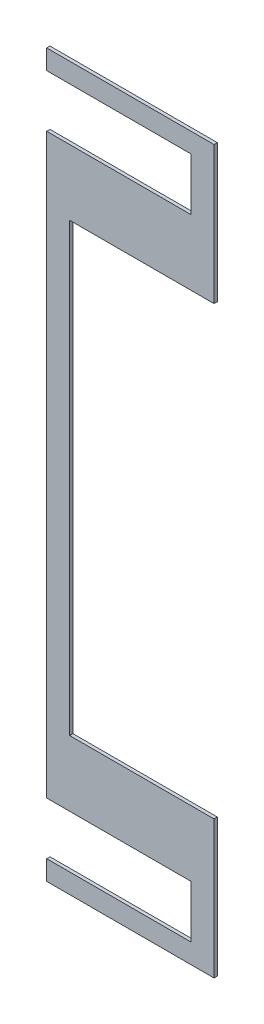
ISO-10303-21;
HEADER;
FILE_DESCRIPTION(('STEP AP214'),'2;1');
FILE_NAME('part.step','',(''),(''),'','','');
FILE_SCHEMA(('AUTOMOTIVE_DESIGN { 1 0 10303 214 1 1 1 1 }'));
ENDSEC;
DATA;
#1=APPLICATION_CONTEXT('core data for automotive mechanical design processes');
#2=APPLICATION_PROTOCOL_DEFINITION('international standard','automotive_design',2000,#1);
#3=PRODUCT_CONTEXT('',#1,'mechanical');
#4=PRODUCT('Part','Part','',(#3));
#5=PRODUCT_RELATED_PRODUCT_CATEGORY('part','',(#4));
#6=PRODUCT_DEFINITION_FORMATION('','',#4);
#7=PRODUCT_DEFINITION_CONTEXT('part definition',#1,'design');
#8=PRODUCT_DEFINITION('design','',#6,#7);
#9=PRODUCT_DEFINITION_SHAPE('','',#8);
#10=(LENGTH_UNIT() NAMED_UNIT(*) SI_UNIT(.MILLI.,.METRE.));
#11=(NAMED_UNIT(*) PLANE_ANGLE_UNIT() SI_UNIT($,.RADIAN.));
#12=(NAMED_UNIT(*) SI_UNIT($,.STERADIAN.) SOLID_ANGLE_UNIT());
#13=UNCERTAINTY_MEASURE_WITH_UNIT(LENGTH_MEASURE(1.E-05),#10,'distance_accuracy_value','');
#14=(GEOMETRIC_REPRESENTATION_CONTEXT(3) GLOBAL_UNCERTAINTY_ASSIGNED_CONTEXT((#13)) GLOBAL_UNIT_ASSIGNED_CONTEXT((#10,
#11,#12)) REPRESENTATION_CONTEXT('',''));
#15=CARTESIAN_POINT('',(0.,0.,0.));
#16=DIRECTION('',(0.,0.,1.));
#17=DIRECTION('',(1.,0.,0.));
#18=AXIS2_PLACEMENT_3D('',#15,#16,#17);
#19=CARTESIAN_POINT('',(0.,19.05,3.175));
#20=DIRECTION('',(1.,0.,0.));
#21=DIRECTION('',(0.,0.,-1.));
#22=AXIS2_PLACEMENT_3D('',#19,#20,#21);
#23=PLANE('',#22);
#24=DIRECTION('',(0.,-1.,0.));
#25=VECTOR('',#24,1.);
#26=CARTESIAN_POINT('',(0.,19.05,0.));
#27=LINE('',#26,#25);
#28=CARTESIAN_POINT('',(0.,19.05,0.));
#29=VERTEX_POINT('',#28);
#30=CARTESIAN_POINT('',(0.,0.,0.));
#31=VERTEX_POINT('',#30);
#32=EDGE_CURVE('E194',#29,#31,#27,.T.);
#33=ORIENTED_EDGE('',*,*,#32,.T.);
#34=DIRECTION('',(0.,0.,-1.));
#35=VECTOR('',#34,1.);
#36=CARTESIAN_POINT('',(0.,0.,3.175));
#37=LINE('',#36,#35);
#38=CARTESIAN_POINT('',(0.,0.,3.175));
#39=VERTEX_POINT('',#38);
#40=EDGE_CURVE('E11',#39,#31,#37,.T.);
#41=ORIENTED_EDGE('',*,*,#40,.F.);
#42=DIRECTION('',(0.,-1.,0.));
#43=VECTOR('',#42,1.);
#44=CARTESIAN_POINT('',(0.,19.05,3.175));
#45=LINE('',#44,#43);
#46=CARTESIAN_POINT('',(0.,19.05,3.175));
#47=VERTEX_POINT('',#46);
#48=EDGE_CURVE('E240',#47,#39,#45,.T.);
#49=ORIENTED_EDGE('',*,*,#48,.F.);
#50=DIRECTION('',(0.,0.,-1.));
#51=VECTOR('',#50,1.);
#52=CARTESIAN_POINT('',(0.,19.05,3.175));
#53=LINE('',#52,#51);
#54=EDGE_CURVE('E190',#47,#29,#53,.T.);
#55=ORIENTED_EDGE('',*,*,#54,.T.);
#56=EDGE_LOOP('',(#33,#41,#49,#55));
#57=FACE_BOUND('',#56,.T.);
#58=ADVANCED_FACE('F45',(#57),#23,.F.);
#59=CARTESIAN_POINT('',(0.,0.,3.175));
#60=DIRECTION('',(0.,1.,0.));
#61=DIRECTION('',(-1.,0.,0.));
#62=AXIS2_PLACEMENT_3D('',#59,#60,#61);
#63=PLANE('',#62);
#64=DIRECTION('',(1.,0.,0.));
#65=VECTOR('',#64,1.);
#66=CARTESIAN_POINT('',(0.,0.,0.));
#67=LINE('',#66,#65);
#68=CARTESIAN_POINT('',(161.925,0.,0.));
#69=VERTEX_POINT('',#68);
#70=EDGE_CURVE('E198',#31,#69,#67,.T.);
#71=ORIENTED_EDGE('',*,*,#70,.T.);
#72=DIRECTION('',(0.,0.,-1.));
#73=VECTOR('',#72,1.);
#74=CARTESIAN_POINT('',(161.925,0.,3.175));
#75=LINE('',#74,#73);
#76=CARTESIAN_POINT('',(161.925,0.,3.175));
#77=VERTEX_POINT('',#76);
#78=EDGE_CURVE('E54',#77,#69,#75,.T.);
#79=ORIENTED_EDGE('',*,*,#78,.F.);
#80=DIRECTION('',(1.,0.,0.));
#81=VECTOR('',#80,1.);
#82=CARTESIAN_POINT('',(0.,0.,3.175));
#83=LINE('',#82,#81);
#84=EDGE_CURVE('E129',#39,#77,#83,.T.);
#85=ORIENTED_EDGE('',*,*,#84,.F.);
#86=ORIENTED_EDGE('',*,*,#40,.T.);
#87=EDGE_LOOP('',(#71,#79,#85,#86));
#88=FACE_BOUND('',#87,.T.);
#89=ADVANCED_FACE('F362',(#88),#63,.F.);
#90=CARTESIAN_POINT('',(161.925,0.,3.175));
#91=DIRECTION('',(-1.,0.,0.));
#92=DIRECTION('',(0.,0.,1.));
#93=AXIS2_PLACEMENT_3D('',#90,#91,#92);
#94=PLANE('',#93);
#95=DIRECTION('',(0.,1.,0.));
#96=VECTOR('',#95,1.);
#97=CARTESIAN_POINT('',(161.925,0.,0.));
#98=LINE('',#97,#96);
#99=CARTESIAN_POINT('',(161.925,133.35,0.));
#100=VERTEX_POINT('',#99);
#101=EDGE_CURVE('E201',#69,#100,#98,.T.);
#102=ORIENTED_EDGE('',*,*,#101,.T.);
#103=DIRECTION('',(0.,0.,-1.));
#104=VECTOR('',#103,1.);
#105=CARTESIAN_POINT('',(161.925,133.35,3.175));
#106=LINE('',#105,#104);
#107=CARTESIAN_POINT('',(161.925,133.35,3.175));
#108=VERTEX_POINT('',#107);
#109=EDGE_CURVE('E283',#108,#100,#106,.T.);
#110=ORIENTED_EDGE('',*,*,#109,.F.);
#111=DIRECTION('',(0.,1.,0.));
#112=VECTOR('',#111,1.);
#113=CARTESIAN_POINT('',(161.925,0.,3.175));
#114=LINE('',#113,#112);
#115=EDGE_CURVE('E293',#77,#108,#114,.T.);
#116=ORIENTED_EDGE('',*,*,#115,.F.);
#117=ORIENTED_EDGE('',*,*,#78,.T.);
#118=EDGE_LOOP('',(#102,#110,#116,#117));
#119=FACE_BOUND('',#118,.T.);
#120=ADVANCED_FACE('F291',(#119),#94,.F.);
#121=CARTESIAN_POINT('',(161.925,133.35,3.175));
#122=DIRECTION('',(0.,-1.,0.));
#123=DIRECTION('',(1.,0.,0.));
#124=AXIS2_PLACEMENT_3D('',#121,#122,#123);
#125=PLANE('',#124);
#126=DIRECTION('',(-1.,0.,0.));
#127=VECTOR('',#126,1.);
#128=CARTESIAN_POINT('',(161.925,133.35,0.));
#129=LINE('',#128,#127);
#130=CARTESIAN_POINT('',(22.225,133.35,0.));
#131=VERTEX_POINT('',#130);
#132=EDGE_CURVE('E204',#100,#131,#129,.T.);
#133=ORIENTED_EDGE('',*,*,#132,.T.);
#134=DIRECTION('',(0.,0.,-1.));
#135=VECTOR('',#134,1.);
#136=CARTESIAN_POINT('',(22.225,133.35,3.175));
#137=LINE('',#136,#135);
#138=CARTESIAN_POINT('',(22.225,133.35,3.175));
#139=VERTEX_POINT('',#138);
#140=EDGE_CURVE('E279',#139,#131,#137,.T.);
#141=ORIENTED_EDGE('',*,*,#140,.F.);
#142=DIRECTION('',(-1.,0.,0.));
#143=VECTOR('',#142,1.);
#144=CARTESIAN_POINT('',(161.925,133.35,3.175));
#145=LINE('',#144,#143);
#146=EDGE_CURVE('E312',#108,#139,#145,.T.);
#147=ORIENTED_EDGE('',*,*,#146,.F.);
#148=ORIENTED_EDGE('',*,*,#109,.T.);
#149=EDGE_LOOP('',(#133,#141,#147,#148));
#150=FACE_BOUND('',#149,.T.);
#151=ADVANCED_FACE('F302',(#150),#125,.F.);
#152=CARTESIAN_POINT('',(22.225,133.35,3.175));
#153=DIRECTION('',(-1.,0.,0.));
#154=DIRECTION('',(0.,-1.,0.));
#155=AXIS2_PLACEMENT_3D('',#152,#153,#154);
#156=PLANE('',#155);
#157=DIRECTION('',(0.,1.,0.));
#158=VECTOR('',#157,1.);
#159=CARTESIAN_POINT('',(22.225,133.35,0.));
#160=LINE('',#159,#158);
#161=CARTESIAN_POINT('',(22.2249999999999,565.15,0.));
#162=VERTEX_POINT('',#161);
#163=EDGE_CURVE('E207',#131,#162,#160,.T.);
#164=ORIENTED_EDGE('',*,*,#163,.T.);
#165=DIRECTION('',(0.,0.,-1.));
#166=VECTOR('',#165,1.);
#167=CARTESIAN_POINT('',(22.2249999999999,565.15,3.175));
#168=LINE('',#167,#166);
#169=CARTESIAN_POINT('',(22.2249999999999,565.15,3.175));
#170=VERTEX_POINT('',#169);
#171=EDGE_CURVE('E275',#170,#162,#168,.T.);
#172=ORIENTED_EDGE('',*,*,#171,.F.);
#173=DIRECTION('',(0.,1.,0.));
#174=VECTOR('',#173,1.);
#175=CARTESIAN_POINT('',(22.225,133.35,3.175));
#176=LINE('',#175,#174);
#177=EDGE_CURVE('E308',#139,#170,#176,.T.);
#178=ORIENTED_EDGE('',*,*,#177,.F.);
#179=ORIENTED_EDGE('',*,*,#140,.T.);
#180=EDGE_LOOP('',(#164,#172,#178,#179));
#181=FACE_BOUND('',#180,.T.);
#182=ADVANCED_FACE('F306',(#181),#156,.F.);
#183=CARTESIAN_POINT('',(22.2249999999999,565.15,3.175));
#184=DIRECTION('',(0.,1.,0.));
#185=DIRECTION('',(-1.,0.,0.));
#186=AXIS2_PLACEMENT_3D('',#183,#184,#185);
#187=PLANE('',#186);
#188=DIRECTION('',(1.,0.,0.));
#189=VECTOR('',#188,1.);
#190=CARTESIAN_POINT('',(22.2249999999999,565.15,0.));
#191=LINE('',#190,#189);
#192=CARTESIAN_POINT('',(161.925,565.15,0.));
#193=VERTEX_POINT('',#192);
#194=EDGE_CURVE('E210',#162,#193,#191,.T.);
#195=ORIENTED_EDGE('',*,*,#194,.T.);
#196=DIRECTION('',(0.,0.,-1.));
#197=VECTOR('',#196,1.);
#198=CARTESIAN_POINT('',(161.925,565.15,3.175));
#199=LINE('',#198,#197);
#200=CARTESIAN_POINT('',(161.925,565.15,3.175));
#201=VERTEX_POINT('',#200);
#202=EDGE_CURVE('E271',#201,#193,#199,.T.);
#203=ORIENTED_EDGE('',*,*,#202,.F.);
#204=DIRECTION('',(1.,0.,0.));
#205=VECTOR('',#204,1.);
#206=CARTESIAN_POINT('',(22.2249999999999,565.15,3.175));
#207=LINE('',#206,#205);
#208=EDGE_CURVE('E311',#170,#201,#207,.T.);
#209=ORIENTED_EDGE('',*,*,#208,.F.);
#210=ORIENTED_EDGE('',*,*,#171,.T.);
#211=EDGE_LOOP('',(#195,#203,#209,#210));
#212=FACE_BOUND('',#211,.T.);
#213=ADVANCED_FACE('F375',(#212),#187,.F.);
#214=CARTESIAN_POINT('',(161.925,565.15,3.175));
#215=DIRECTION('',(-1.,0.,0.));
#216=DIRECTION('',(0.,-1.,0.));
#217=AXIS2_PLACEMENT_3D('',#214,#215,#216);
#218=PLANE('',#217);
#219=DIRECTION('',(0.,1.,0.));
#220=VECTOR('',#219,1.);
#221=CARTESIAN_POINT('',(161.925,565.15,0.));
#222=LINE('',#221,#220);
#223=CARTESIAN_POINT('',(161.925,698.5,0.));
#224=VERTEX_POINT('',#223);
#225=EDGE_CURVE('E213',#193,#224,#222,.T.);
#226=ORIENTED_EDGE('',*,*,#225,.T.);
#227=DIRECTION('',(0.,0.,-1.));
#228=VECTOR('',#227,1.);
#229=CARTESIAN_POINT('',(161.925,698.5,3.175));
#230=LINE('',#229,#228);
#231=CARTESIAN_POINT('',(161.925,698.5,3.175));
#232=VERTEX_POINT('',#231);
#233=EDGE_CURVE('E267',#232,#224,#230,.T.);
#234=ORIENTED_EDGE('',*,*,#233,.F.);
#235=DIRECTION('',(0.,1.,0.));
#236=VECTOR('',#235,1.);
#237=CARTESIAN_POINT('',(161.925,565.15,3.175));
#238=LINE('',#237,#236);
#239=EDGE_CURVE('E316',#201,#232,#238,.T.);
#240=ORIENTED_EDGE('',*,*,#239,.F.);
#241=ORIENTED_EDGE('',*,*,#202,.T.);
#242=EDGE_LOOP('',(#226,#234,#240,#241));
#243=FACE_BOUND('',#242,.T.);
#244=ADVANCED_FACE('F378',(#243),#218,.F.);
#245=CARTESIAN_POINT('',(161.925,698.5,3.175));
#246=DIRECTION('',(0.,-1.,0.));
#247=DIRECTION('',(0.,0.,-1.));
#248=AXIS2_PLACEMENT_3D('',#245,#246,#247);
#249=PLANE('',#248);
#250=DIRECTION('',(-1.,0.,0.));
#251=VECTOR('',#250,1.);
#252=CARTESIAN_POINT('',(161.925,698.5,0.));
#253=LINE('',#252,#251);
#254=CARTESIAN_POINT('',(0.,698.5,0.));
#255=VERTEX_POINT('',#254);
#256=EDGE_CURVE('E216',#224,#255,#253,.T.);
#257=ORIENTED_EDGE('',*,*,#256,.T.);
#258=DIRECTION('',(0.,0.,-1.));
#259=VECTOR('',#258,1.);
#260=CARTESIAN_POINT('',(0.,698.5,3.175));
#261=LINE('',#260,#259);
#262=CARTESIAN_POINT('',(0.,698.5,3.175));
#263=VERTEX_POINT('',#262);
#264=EDGE_CURVE('E263',#263,#255,#261,.T.);
#265=ORIENTED_EDGE('',*,*,#264,.F.);
#266=DIRECTION('',(-1.,0.,0.));
#267=VECTOR('',#266,1.);
#268=CARTESIAN_POINT('',(161.925,698.5,3.175));
#269=LINE('',#268,#267);
#270=EDGE_CURVE('E323',#232,#263,#269,.T.);
#271=ORIENTED_EDGE('',*,*,#270,.F.);
#272=ORIENTED_EDGE('',*,*,#233,.T.);
#273=EDGE_LOOP('',(#257,#265,#271,#272));
#274=FACE_BOUND('',#273,.T.);
#275=ADVANCED_FACE('F382',(#274),#249,.F.);
#276=CARTESIAN_POINT('',(0.,698.5,3.175));
#277=DIRECTION('',(1.,0.,0.));
#278=DIRECTION('',(0.,1.,0.));
#279=AXIS2_PLACEMENT_3D('',#276,#277,#278);
#280=PLANE('',#279);
#281=DIRECTION('',(0.,-1.,0.));
#282=VECTOR('',#281,1.);
#283=CARTESIAN_POINT('',(0.,698.5,0.));
#284=LINE('',#283,#282);
#285=CARTESIAN_POINT('',(0.,679.45,0.));
#286=VERTEX_POINT('',#285);
#287=EDGE_CURVE('E219',#255,#286,#284,.T.);
#288=ORIENTED_EDGE('',*,*,#287,.T.);
#289=DIRECTION('',(0.,0.,-1.));
#290=VECTOR('',#289,1.);
#291=CARTESIAN_POINT('',(0.,679.45,3.175));
#292=LINE('',#291,#290);
#293=CARTESIAN_POINT('',(0.,679.45,3.175));
#294=VERTEX_POINT('',#293);
#295=EDGE_CURVE('E259',#294,#286,#292,.T.);
#296=ORIENTED_EDGE('',*,*,#295,.F.);
#297=DIRECTION('',(0.,-1.,0.));
#298=VECTOR('',#297,1.);
#299=CARTESIAN_POINT('',(0.,698.5,3.175));
#300=LINE('',#299,#298);
#301=EDGE_CURVE('E326',#263,#294,#300,.T.);
#302=ORIENTED_EDGE('',*,*,#301,.F.);
#303=ORIENTED_EDGE('',*,*,#264,.T.);
#304=EDGE_LOOP('',(#288,#296,#302,#303));
#305=FACE_BOUND('',#304,.T.);
#306=ADVANCED_FACE('F386',(#305),#280,.F.);
#307=CARTESIAN_POINT('',(0.,679.45,3.175));
#308=DIRECTION('',(0.,1.,0.));
#309=DIRECTION('',(0.,0.,1.));
#310=AXIS2_PLACEMENT_3D('',#307,#308,#309);
#311=PLANE('',#310);
#312=DIRECTION('',(1.,0.,0.));
#313=VECTOR('',#312,1.);
#314=CARTESIAN_POINT('',(0.,679.45,0.));
#315=LINE('',#314,#313);
#316=CARTESIAN_POINT('',(139.7,679.45,0.));
#317=VERTEX_POINT('',#316);
#318=EDGE_CURVE('E222',#286,#317,#315,.T.);
#319=ORIENTED_EDGE('',*,*,#318,.T.);
#320=DIRECTION('',(0.,0.,-1.));
#321=VECTOR('',#320,1.);
#322=CARTESIAN_POINT('',(139.7,679.45,3.175));
#323=LINE('',#322,#321);
#324=CARTESIAN_POINT('',(139.7,679.45,3.175));
#325=VERTEX_POINT('',#324);
#326=EDGE_CURVE('E255',#325,#317,#323,.T.);
#327=ORIENTED_EDGE('',*,*,#326,.F.);
#328=DIRECTION('',(1.,0.,0.));
#329=VECTOR('',#328,1.);
#330=CARTESIAN_POINT('',(0.,679.45,3.175));
#331=LINE('',#330,#329);
#332=EDGE_CURVE('E329',#294,#325,#331,.T.);
#333=ORIENTED_EDGE('',*,*,#332,.F.);
#334=ORIENTED_EDGE('',*,*,#295,.T.);
#335=EDGE_LOOP('',(#319,#327,#333,#334));
#336=FACE_BOUND('',#335,.T.);
#337=ADVANCED_FACE('F390',(#336),#311,.F.);
#338=CARTESIAN_POINT('',(139.7,679.45,3.175));
#339=DIRECTION('',(1.,0.,0.));
#340=DIRECTION('',(0.,1.,0.));
#341=AXIS2_PLACEMENT_3D('',#338,#339,#340);
#342=PLANE('',#341);
#343=DIRECTION('',(0.,-1.,0.));
#344=VECTOR('',#343,1.);
#345=CARTESIAN_POINT('',(139.7,679.45,0.));
#346=LINE('',#345,#344);
#347=CARTESIAN_POINT('',(139.7,628.65,0.));
#348=VERTEX_POINT('',#347);
#349=EDGE_CURVE('E225',#317,#348,#346,.T.);
#350=ORIENTED_EDGE('',*,*,#349,.T.);
#351=DIRECTION('',(0.,0.,-1.));
#352=VECTOR('',#351,1.);
#353=CARTESIAN_POINT('',(139.7,628.65,3.175));
#354=LINE('',#353,#352);
#355=CARTESIAN_POINT('',(139.7,628.65,3.175));
#356=VERTEX_POINT('',#355);
#357=EDGE_CURVE('E251',#356,#348,#354,.T.);
#358=ORIENTED_EDGE('',*,*,#357,.F.);
#359=DIRECTION('',(0.,-1.,0.));
#360=VECTOR('',#359,1.);
#361=CARTESIAN_POINT('',(139.7,679.45,3.175));
#362=LINE('',#361,#360);
#363=EDGE_CURVE('E332',#325,#356,#362,.T.);
#364=ORIENTED_EDGE('',*,*,#363,.F.);
#365=ORIENTED_EDGE('',*,*,#326,.T.);
#366=EDGE_LOOP('',(#350,#358,#364,#365));
#367=FACE_BOUND('',#366,.T.);
#368=ADVANCED_FACE('F394',(#367),#342,.F.);
#369=CARTESIAN_POINT('',(139.7,628.65,3.175));
#370=DIRECTION('',(0.,-1.,0.));
#371=DIRECTION('',(1.,0.,0.));
#372=AXIS2_PLACEMENT_3D('',#369,#370,#371);
#373=PLANE('',#372);
#374=DIRECTION('',(-1.,0.,0.));
#375=VECTOR('',#374,1.);
#376=CARTESIAN_POINT('',(139.7,628.65,0.));
#377=LINE('',#376,#375);
#378=CARTESIAN_POINT('',(0.,628.65,0.));
#379=VERTEX_POINT('',#378);
#380=EDGE_CURVE('E228',#348,#379,#377,.T.);
#381=ORIENTED_EDGE('',*,*,#380,.T.);
#382=DIRECTION('',(0.,0.,-1.));
#383=VECTOR('',#382,1.);
#384=CARTESIAN_POINT('',(0.,628.65,3.175));
#385=LINE('',#384,#383);
#386=CARTESIAN_POINT('',(0.,628.65,3.175));
#387=VERTEX_POINT('',#386);
#388=EDGE_CURVE('E247',#387,#379,#385,.T.);
#389=ORIENTED_EDGE('',*,*,#388,.F.);
#390=DIRECTION('',(-1.,0.,0.));
#391=VECTOR('',#390,1.);
#392=CARTESIAN_POINT('',(139.7,628.65,3.175));
#393=LINE('',#392,#391);
#394=EDGE_CURVE('E335',#356,#387,#393,.T.);
#395=ORIENTED_EDGE('',*,*,#394,.F.);
#396=ORIENTED_EDGE('',*,*,#357,.T.);
#397=EDGE_LOOP('',(#381,#389,#395,#396));
#398=FACE_BOUND('',#397,.T.);
#399=ADVANCED_FACE('F343',(#398),#373,.F.);
#400=CARTESIAN_POINT('',(0.,628.65,3.175));
#401=DIRECTION('',(1.,0.,0.));
#402=DIRECTION('',(0.,1.,0.));
#403=AXIS2_PLACEMENT_3D('',#400,#401,#402);
#404=PLANE('',#403);
#405=DIRECTION('',(0.,-1.,0.));
#406=VECTOR('',#405,1.);
#407=CARTESIAN_POINT('',(0.,628.65,0.));
#408=LINE('',#407,#406);
#409=CARTESIAN_POINT('',(0.,69.8500000000001,0.));
#410=VERTEX_POINT('',#409);
#411=EDGE_CURVE('E231',#379,#410,#408,.T.);
#412=ORIENTED_EDGE('',*,*,#411,.T.);
#413=DIRECTION('',(0.,0.,-1.));
#414=VECTOR('',#413,1.);
#415=CARTESIAN_POINT('',(0.,69.8500000000001,3.175));
#416=LINE('',#415,#414);
#417=CARTESIAN_POINT('',(0.,69.8500000000001,3.175));
#418=VERTEX_POINT('',#417);
#419=EDGE_CURVE('E183',#418,#410,#416,.T.);
#420=ORIENTED_EDGE('',*,*,#419,.F.);
#421=DIRECTION('',(0.,-1.,0.));
#422=VECTOR('',#421,1.);
#423=CARTESIAN_POINT('',(0.,628.65,3.175));
#424=LINE('',#423,#422);
#425=EDGE_CURVE('E172',#387,#418,#424,.T.);
#426=ORIENTED_EDGE('',*,*,#425,.F.);
#427=ORIENTED_EDGE('',*,*,#388,.T.);
#428=EDGE_LOOP('',(#412,#420,#426,#427));
#429=FACE_BOUND('',#428,.T.);
#430=ADVANCED_FACE('F347',(#429),#404,.F.);
#431=CARTESIAN_POINT('',(0.,69.8500000000001,3.175));
#432=DIRECTION('',(0.,1.,0.));
#433=DIRECTION('',(-1.,0.,0.));
#434=AXIS2_PLACEMENT_3D('',#431,#432,#433);
#435=PLANE('',#434);
#436=DIRECTION('',(1.,0.,0.));
#437=VECTOR('',#436,1.);
#438=CARTESIAN_POINT('',(0.,69.8500000000001,0.));
#439=LINE('',#438,#437);
#440=CARTESIAN_POINT('',(139.7,69.85,0.));
#441=VERTEX_POINT('',#440);
#442=EDGE_CURVE('E181',#410,#441,#439,.T.);
#443=ORIENTED_EDGE('',*,*,#442,.T.);
#444=DIRECTION('',(0.,0.,-1.));
#445=VECTOR('',#444,1.);
#446=CARTESIAN_POINT('',(139.7,69.85,3.175));
#447=LINE('',#446,#445);
#448=CARTESIAN_POINT('',(139.7,69.85,3.175));
#449=VERTEX_POINT('',#448);
#450=EDGE_CURVE('E178',#449,#441,#447,.T.);
#451=ORIENTED_EDGE('',*,*,#450,.F.);
#452=DIRECTION('',(1.,0.,0.));
#453=VECTOR('',#452,1.);
#454=CARTESIAN_POINT('',(0.,69.8500000000001,3.175));
#455=LINE('',#454,#453);
#456=EDGE_CURVE('E166',#418,#449,#455,.T.);
#457=ORIENTED_EDGE('',*,*,#456,.F.);
#458=ORIENTED_EDGE('',*,*,#419,.T.);
#459=EDGE_LOOP('',(#443,#451,#457,#458));
#460=FACE_BOUND('',#459,.T.);
#461=ADVANCED_FACE('F179',(#460),#435,.F.);
#462=CARTESIAN_POINT('',(139.7,69.85,3.175));
#463=DIRECTION('',(1.,0.,0.));
#464=DIRECTION('',(0.,0.,-1.));
#465=AXIS2_PLACEMENT_3D('',#462,#463,#464);
#466=PLANE('',#465);
#467=DIRECTION('',(0.,-1.,0.));
#468=VECTOR('',#467,1.);
#469=CARTESIAN_POINT('',(139.7,69.85,0.));
#470=LINE('',#469,#468);
#471=CARTESIAN_POINT('',(139.7,19.05,0.));
#472=VERTEX_POINT('',#471);
#473=EDGE_CURVE('E115',#441,#472,#470,.T.);
#474=ORIENTED_EDGE('',*,*,#473,.T.);
#475=DIRECTION('',(0.,0.,-1.));
#476=VECTOR('',#475,1.);
#477=CARTESIAN_POINT('',(139.7,19.05,3.175));
#478=LINE('',#477,#476);
#479=CARTESIAN_POINT('',(139.7,19.05,3.175));
#480=VERTEX_POINT('',#479);
#481=EDGE_CURVE('E184',#480,#472,#478,.T.);
#482=ORIENTED_EDGE('',*,*,#481,.F.);
#483=DIRECTION('',(0.,-1.,0.));
#484=VECTOR('',#483,1.);
#485=CARTESIAN_POINT('',(139.7,69.85,3.175));
#486=LINE('',#485,#484);
#487=EDGE_CURVE('E170',#449,#480,#486,.T.);
#488=ORIENTED_EDGE('',*,*,#487,.F.);
#489=ORIENTED_EDGE('',*,*,#450,.T.);
#490=EDGE_LOOP('',(#474,#482,#488,#489));
#491=FACE_BOUND('',#490,.T.);
#492=ADVANCED_FACE('F186',(#491),#466,.F.);
#493=CARTESIAN_POINT('',(139.7,19.05,3.175));
#494=DIRECTION('',(0.,-1.,0.));
#495=DIRECTION('',(0.,0.,-1.));
#496=AXIS2_PLACEMENT_3D('',#493,#494,#495);
#497=PLANE('',#496);
#498=DIRECTION('',(-1.,0.,0.));
#499=VECTOR('',#498,1.);
#500=CARTESIAN_POINT('',(139.7,19.05,0.));
#501=LINE('',#500,#499);
#502=EDGE_CURVE('E121',#472,#29,#501,.T.);
#503=ORIENTED_EDGE('',*,*,#502,.T.);
#504=ORIENTED_EDGE('',*,*,#54,.F.);
#505=DIRECTION('',(-1.,0.,0.));
#506=VECTOR('',#505,1.);
#507=CARTESIAN_POINT('',(139.7,19.05,3.175));
#508=LINE('',#507,#506);
#509=EDGE_CURVE('E62',#480,#47,#508,.T.);
#510=ORIENTED_EDGE('',*,*,#509,.F.);
#511=ORIENTED_EDGE('',*,*,#481,.T.);
#512=EDGE_LOOP('',(#503,#504,#510,#511));
#513=FACE_BOUND('',#512,.T.);
#514=ADVANCED_FACE('F351',(#513),#497,.F.);
#515=CARTESIAN_POINT('',(0.,0.,3.175));
#516=DIRECTION('',(0.,0.,1.));
#517=DIRECTION('',(1.,0.,0.));
#518=AXIS2_PLACEMENT_3D('',#515,#516,#517);
#519=PLANE('',#518);
#520=ORIENTED_EDGE('',*,*,#48,.T.);
#521=ORIENTED_EDGE('',*,*,#84,.T.);
#522=ORIENTED_EDGE('',*,*,#115,.T.);
#523=ORIENTED_EDGE('',*,*,#146,.T.);
#524=ORIENTED_EDGE('',*,*,#177,.T.);
#525=ORIENTED_EDGE('',*,*,#208,.T.);
#526=ORIENTED_EDGE('',*,*,#239,.T.);
#527=ORIENTED_EDGE('',*,*,#270,.T.);
#528=ORIENTED_EDGE('',*,*,#301,.T.);
#529=ORIENTED_EDGE('',*,*,#332,.T.);
#530=ORIENTED_EDGE('',*,*,#363,.T.);
#531=ORIENTED_EDGE('',*,*,#394,.T.);
#532=ORIENTED_EDGE('',*,*,#425,.T.);
#533=ORIENTED_EDGE('',*,*,#456,.T.);
#534=ORIENTED_EDGE('',*,*,#487,.T.);
#535=ORIENTED_EDGE('',*,*,#509,.T.);
#536=EDGE_LOOP('',(#520,#521,#522,#523,#524,#525,#526,#527,#528,#529,#530,#531,#532,#533,#534,#535));
#537=FACE_BOUND('',#536,.T.);
#538=ADVANCED_FACE('F168',(#537),#519,.T.);
#539=CARTESIAN_POINT('',(0.,0.,0.));
#540=DIRECTION('',(0.,0.,1.));
#541=DIRECTION('',(1.,0.,0.));
#542=AXIS2_PLACEMENT_3D('',#539,#540,#541);
#543=PLANE('',#542);
#544=ORIENTED_EDGE('',*,*,#32,.F.);
#545=ORIENTED_EDGE('',*,*,#502,.F.);
#546=ORIENTED_EDGE('',*,*,#473,.F.);
#547=ORIENTED_EDGE('',*,*,#442,.F.);
#548=ORIENTED_EDGE('',*,*,#411,.F.);
#549=ORIENTED_EDGE('',*,*,#380,.F.);
#550=ORIENTED_EDGE('',*,*,#349,.F.);
#551=ORIENTED_EDGE('',*,*,#318,.F.);
#552=ORIENTED_EDGE('',*,*,#287,.F.);
#553=ORIENTED_EDGE('',*,*,#256,.F.);
#554=ORIENTED_EDGE('',*,*,#225,.F.);
#555=ORIENTED_EDGE('',*,*,#194,.F.);
#556=ORIENTED_EDGE('',*,*,#163,.F.);
#557=ORIENTED_EDGE('',*,*,#132,.F.);
#558=ORIENTED_EDGE('',*,*,#101,.F.);
#559=ORIENTED_EDGE('',*,*,#70,.F.);
#560=EDGE_LOOP('',(#544,#545,#546,#547,#548,#549,#550,#551,#552,#553,#554,#555,#556,#557,#558,#559));
#561=FACE_BOUND('',#560,.T.);
#562=ADVANCED_FACE('F297',(#561),#543,.F.);
#563=CLOSED_SHELL('',(#58,#89,#120,#151,#182,#213,#244,#275,#306,#337,#368,#399,#430,#461,#492,
#514,#538,#562));
#564=MANIFOLD_SOLID_BREP('B2',#563);
#565=ADVANCED_BREP_SHAPE_REPRESENTATION('',(#18,#564),#14);
#566=SHAPE_DEFINITION_REPRESENTATION(#9,#565);
ENDSEC;
END-ISO-10303-21;
